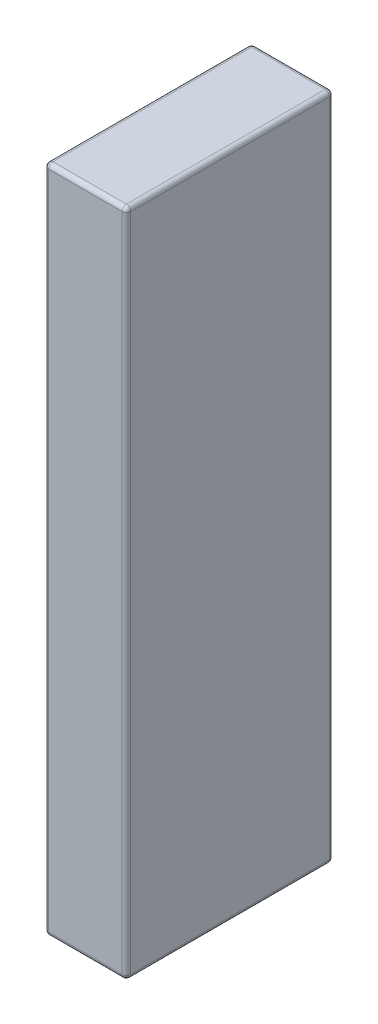
ISO-10303-21;
HEADER;
FILE_DESCRIPTION(('STEP AP214'),'2;1');
FILE_NAME('part.step','',(''),(''),'','','');
FILE_SCHEMA(('AUTOMOTIVE_DESIGN { 1 0 10303 214 1 1 1 1 }'));
ENDSEC;
DATA;
#1=APPLICATION_CONTEXT('core data for automotive mechanical design processes');
#2=APPLICATION_PROTOCOL_DEFINITION('international standard','automotive_design',2000,#1);
#3=PRODUCT_CONTEXT('',#1,'mechanical');
#4=PRODUCT('Part','Part','',(#3));
#5=PRODUCT_RELATED_PRODUCT_CATEGORY('part','',(#4));
#6=PRODUCT_DEFINITION_FORMATION('','',#4);
#7=PRODUCT_DEFINITION_CONTEXT('part definition',#1,'design');
#8=PRODUCT_DEFINITION('design','',#6,#7);
#9=PRODUCT_DEFINITION_SHAPE('','',#8);
#10=(LENGTH_UNIT() NAMED_UNIT(*) SI_UNIT(.MILLI.,.METRE.));
#11=(NAMED_UNIT(*) PLANE_ANGLE_UNIT() SI_UNIT($,.RADIAN.));
#12=(NAMED_UNIT(*) SI_UNIT($,.STERADIAN.) SOLID_ANGLE_UNIT());
#13=UNCERTAINTY_MEASURE_WITH_UNIT(LENGTH_MEASURE(1.E-05),#10,'distance_accuracy_value','');
#14=(GEOMETRIC_REPRESENTATION_CONTEXT(3) GLOBAL_UNCERTAINTY_ASSIGNED_CONTEXT((#13)) GLOBAL_UNIT_ASSIGNED_CONTEXT((#10,
#11,#12)) REPRESENTATION_CONTEXT('',''));
#15=CARTESIAN_POINT('',(0.,0.,0.));
#16=DIRECTION('',(0.,0.,1.));
#17=DIRECTION('',(1.,0.,0.));
#18=AXIS2_PLACEMENT_3D('',#15,#16,#17);
#19=CARTESIAN_POINT('',(-9.50000000000001,77.5,48.));
#20=DIRECTION('',(1.,0.,0.));
#21=DIRECTION('',(0.,1.,0.));
#22=AXIS2_PLACEMENT_3D('',#19,#20,#21);
#23=PLANE('',#22);
#24=DIRECTION('',(0.,0.,-1.));
#25=VECTOR('',#24,1.);
#26=CARTESIAN_POINT('',(-9.50000000000001,76.5,48.));
#27=LINE('',#26,#25);
#28=CARTESIAN_POINT('',(-9.50000000000001,76.5,47.));
#29=VERTEX_POINT('',#28);
#30=CARTESIAN_POINT('',(-9.50000000000001,76.5,1.));
#31=VERTEX_POINT('',#30);
#32=EDGE_CURVE('E139',#29,#31,#27,.T.);
#33=ORIENTED_EDGE('',*,*,#32,.T.);
#34=DIRECTION('',(0.,-1.,0.));
#35=VECTOR('',#34,1.);
#36=CARTESIAN_POINT('',(-9.49999999999999,-77.5,1.));
#37=LINE('',#36,#35);
#38=CARTESIAN_POINT('',(-9.49999999999999,-76.5,1.));
#39=VERTEX_POINT('',#38);
#40=EDGE_CURVE('E135',#31,#39,#37,.T.);
#41=ORIENTED_EDGE('',*,*,#40,.T.);
#42=DIRECTION('',(0.,0.,-1.));
#43=VECTOR('',#42,1.);
#44=CARTESIAN_POINT('',(-9.49999999999999,-76.5,48.));
#45=LINE('',#44,#43);
#46=CARTESIAN_POINT('',(-9.49999999999999,-76.5,47.));
#47=VERTEX_POINT('',#46);
#48=EDGE_CURVE('E128',#39,#47,#45,.F.);
#49=ORIENTED_EDGE('',*,*,#48,.T.);
#50=DIRECTION('',(0.,-1.,0.));
#51=VECTOR('',#50,1.);
#52=CARTESIAN_POINT('',(-9.50000000000001,77.5,47.));
#53=LINE('',#52,#51);
#54=EDGE_CURVE('E132',#47,#29,#53,.F.);
#55=ORIENTED_EDGE('',*,*,#54,.T.);
#56=EDGE_LOOP('',(#33,#41,#49,#55));
#57=FACE_BOUND('',#56,.T.);
#58=ADVANCED_FACE('F40',(#57),#23,.F.);
#59=CARTESIAN_POINT('',(9.50000000000001,-77.5,48.));
#60=DIRECTION('',(0.,1.,0.));
#61=DIRECTION('',(-1.,0.,0.));
#62=AXIS2_PLACEMENT_3D('',#59,#60,#61);
#63=PLANE('',#62);
#64=DIRECTION('',(0.,0.,-1.));
#65=VECTOR('',#64,1.);
#66=CARTESIAN_POINT('',(-8.49999999999999,-77.5,48.));
#67=LINE('',#66,#65);
#68=CARTESIAN_POINT('',(-8.49999999999999,-77.5,47.));
#69=VERTEX_POINT('',#68);
#70=CARTESIAN_POINT('',(-8.49999999999999,-77.5,1.));
#71=VERTEX_POINT('',#70);
#72=EDGE_CURVE('E147',#69,#71,#67,.T.);
#73=ORIENTED_EDGE('',*,*,#72,.T.);
#74=DIRECTION('',(1.,0.,0.));
#75=VECTOR('',#74,1.);
#76=CARTESIAN_POINT('',(9.50000000000001,-77.5,1.));
#77=LINE('',#76,#75);
#78=CARTESIAN_POINT('',(8.50000000000001,-77.5,1.));
#79=VERTEX_POINT('',#78);
#80=EDGE_CURVE('E185',#71,#79,#77,.T.);
#81=ORIENTED_EDGE('',*,*,#80,.T.);
#82=DIRECTION('',(0.,0.,-1.));
#83=VECTOR('',#82,1.);
#84=CARTESIAN_POINT('',(8.50000000000001,-77.5,48.));
#85=LINE('',#84,#83);
#86=CARTESIAN_POINT('',(8.50000000000001,-77.5,47.));
#87=VERTEX_POINT('',#86);
#88=EDGE_CURVE('E182',#79,#87,#85,.F.);
#89=ORIENTED_EDGE('',*,*,#88,.T.);
#90=DIRECTION('',(1.,0.,0.));
#91=VECTOR('',#90,1.);
#92=CARTESIAN_POINT('',(9.50000000000001,-77.5,47.));
#93=LINE('',#92,#91);
#94=EDGE_CURVE('E180',#87,#69,#93,.F.);
#95=ORIENTED_EDGE('',*,*,#94,.T.);
#96=EDGE_LOOP('',(#73,#81,#89,#95));
#97=FACE_BOUND('',#96,.T.);
#98=ADVANCED_FACE('F302',(#97),#63,.F.);
#99=CARTESIAN_POINT('',(9.49999999999999,77.5,48.));
#100=DIRECTION('',(-1.,0.,0.));
#101=DIRECTION('',(0.,-1.,0.));
#102=AXIS2_PLACEMENT_3D('',#99,#100,#101);
#103=PLANE('',#102);
#104=DIRECTION('',(0.,0.,-1.));
#105=VECTOR('',#104,1.);
#106=CARTESIAN_POINT('',(9.50000000000001,-76.5,48.));
#107=LINE('',#106,#105);
#108=CARTESIAN_POINT('',(9.50000000000001,-76.5,47.));
#109=VERTEX_POINT('',#108);
#110=CARTESIAN_POINT('',(9.50000000000001,-76.5,1.));
#111=VERTEX_POINT('',#110);
#112=EDGE_CURVE('E191',#109,#111,#107,.T.);
#113=ORIENTED_EDGE('',*,*,#112,.T.);
#114=DIRECTION('',(0.,1.,0.));
#115=VECTOR('',#114,1.);
#116=CARTESIAN_POINT('',(9.49999999999999,77.5,1.));
#117=LINE('',#116,#115);
#118=CARTESIAN_POINT('',(9.49999999999999,76.5,1.));
#119=VERTEX_POINT('',#118);
#120=EDGE_CURVE('E194',#111,#119,#117,.T.);
#121=ORIENTED_EDGE('',*,*,#120,.T.);
#122=DIRECTION('',(0.,0.,-1.));
#123=VECTOR('',#122,1.);
#124=CARTESIAN_POINT('',(9.49999999999999,76.5,48.));
#125=LINE('',#124,#123);
#126=CARTESIAN_POINT('',(9.49999999999999,76.5,47.));
#127=VERTEX_POINT('',#126);
#128=EDGE_CURVE('E189',#119,#127,#125,.F.);
#129=ORIENTED_EDGE('',*,*,#128,.T.);
#130=DIRECTION('',(0.,1.,0.));
#131=VECTOR('',#130,1.);
#132=CARTESIAN_POINT('',(9.49999999999999,77.5,47.));
#133=LINE('',#132,#131);
#134=EDGE_CURVE('E187',#127,#109,#133,.F.);
#135=ORIENTED_EDGE('',*,*,#134,.T.);
#136=EDGE_LOOP('',(#113,#121,#129,#135));
#137=FACE_BOUND('',#136,.T.);
#138=ADVANCED_FACE('F279',(#137),#103,.F.);
#139=CARTESIAN_POINT('',(9.49999999999999,77.5,48.));
#140=DIRECTION('',(0.,-1.,0.));
#141=DIRECTION('',(0.,0.,-1.));
#142=AXIS2_PLACEMENT_3D('',#139,#140,#141);
#143=PLANE('',#142);
#144=DIRECTION('',(0.,0.,-1.));
#145=VECTOR('',#144,1.);
#146=CARTESIAN_POINT('',(8.49999999999999,77.5,48.));
#147=LINE('',#146,#145);
#148=CARTESIAN_POINT('',(8.49999999999999,77.5,47.));
#149=VERTEX_POINT('',#148);
#150=CARTESIAN_POINT('',(8.49999999999999,77.5,1.));
#151=VERTEX_POINT('',#150);
#152=EDGE_CURVE('E173',#149,#151,#147,.T.);
#153=ORIENTED_EDGE('',*,*,#152,.T.);
#154=DIRECTION('',(-1.,0.,0.));
#155=VECTOR('',#154,1.);
#156=CARTESIAN_POINT('',(-9.50000000000001,77.5,1.));
#157=LINE('',#156,#155);
#158=CARTESIAN_POINT('',(-8.50000000000001,77.5,1.));
#159=VERTEX_POINT('',#158);
#160=EDGE_CURVE('E178',#151,#159,#157,.T.);
#161=ORIENTED_EDGE('',*,*,#160,.T.);
#162=DIRECTION('',(0.,0.,-1.));
#163=VECTOR('',#162,1.);
#164=CARTESIAN_POINT('',(-8.50000000000001,77.5,48.));
#165=LINE('',#164,#163);
#166=CARTESIAN_POINT('',(-8.50000000000001,77.5,47.));
#167=VERTEX_POINT('',#166);
#168=EDGE_CURVE('E175',#159,#167,#165,.F.);
#169=ORIENTED_EDGE('',*,*,#168,.T.);
#170=DIRECTION('',(-1.,0.,0.));
#171=VECTOR('',#170,1.);
#172=CARTESIAN_POINT('',(9.49999999999999,77.5,47.));
#173=LINE('',#172,#171);
#174=EDGE_CURVE('E171',#167,#149,#173,.F.);
#175=ORIENTED_EDGE('',*,*,#174,.T.);
#176=EDGE_LOOP('',(#153,#161,#169,#175));
#177=FACE_BOUND('',#176,.T.);
#178=ADVANCED_FACE('F309',(#177),#143,.F.);
#179=CARTESIAN_POINT('',(0.,0.,48.));
#180=DIRECTION('',(0.,0.,-1.));
#181=DIRECTION('',(-1.,0.,0.));
#182=AXIS2_PLACEMENT_3D('',#179,#180,#181);
#183=PLANE('',#182);
#184=DIRECTION('',(0.,1.,0.));
#185=VECTOR('',#184,1.);
#186=CARTESIAN_POINT('',(8.5,0.,48.));
#187=LINE('',#186,#185);
#188=CARTESIAN_POINT('',(8.50000000000001,-76.5,48.));
#189=VERTEX_POINT('',#188);
#190=CARTESIAN_POINT('',(8.49999999999999,76.5,48.));
#191=VERTEX_POINT('',#190);
#192=EDGE_CURVE('E49',#189,#191,#187,.T.);
#193=ORIENTED_EDGE('',*,*,#192,.T.);
#194=DIRECTION('',(-1.,0.,0.));
#195=VECTOR('',#194,1.);
#196=CARTESIAN_POINT('',(0.,76.5,48.));
#197=LINE('',#196,#195);
#198=CARTESIAN_POINT('',(-8.50000000000001,76.5,48.));
#199=VERTEX_POINT('',#198);
#200=EDGE_CURVE('E11',#191,#199,#197,.T.);
#201=ORIENTED_EDGE('',*,*,#200,.T.);
#202=DIRECTION('',(0.,-1.,0.));
#203=VECTOR('',#202,1.);
#204=CARTESIAN_POINT('',(-8.5,0.,48.));
#205=LINE('',#204,#203);
#206=CARTESIAN_POINT('',(-8.49999999999999,-76.5,48.));
#207=VERTEX_POINT('',#206);
#208=EDGE_CURVE('E205',#199,#207,#205,.T.);
#209=ORIENTED_EDGE('',*,*,#208,.T.);
#210=DIRECTION('',(1.,0.,0.));
#211=VECTOR('',#210,1.);
#212=CARTESIAN_POINT('',(0.,-76.5,48.));
#213=LINE('',#212,#211);
#214=EDGE_CURVE('E60',#207,#189,#213,.T.);
#215=ORIENTED_EDGE('',*,*,#214,.T.);
#216=EDGE_LOOP('',(#193,#201,#209,#215));
#217=FACE_BOUND('',#216,.T.);
#218=ADVANCED_FACE('F372',(#217),#183,.F.);
#219=CARTESIAN_POINT('',(0.,0.,0.));
#220=DIRECTION('',(0.,0.,-1.));
#221=DIRECTION('',(-1.,0.,0.));
#222=AXIS2_PLACEMENT_3D('',#219,#220,#221);
#223=PLANE('',#222);
#224=DIRECTION('',(0.,1.,0.));
#225=VECTOR('',#224,1.);
#226=CARTESIAN_POINT('',(8.50000000000001,-77.5,0.));
#227=LINE('',#226,#225);
#228=CARTESIAN_POINT('',(8.49999999999999,76.5,0.));
#229=VERTEX_POINT('',#228);
#230=CARTESIAN_POINT('',(8.50000000000001,-76.5,0.));
#231=VERTEX_POINT('',#230);
#232=EDGE_CURVE('E200',#229,#231,#227,.F.);
#233=ORIENTED_EDGE('',*,*,#232,.T.);
#234=DIRECTION('',(1.,0.,0.));
#235=VECTOR('',#234,1.);
#236=CARTESIAN_POINT('',(-9.49999999999999,-76.5,0.));
#237=LINE('',#236,#235);
#238=CARTESIAN_POINT('',(-8.49999999999999,-76.5,0.));
#239=VERTEX_POINT('',#238);
#240=EDGE_CURVE('E202',#231,#239,#237,.F.);
#241=ORIENTED_EDGE('',*,*,#240,.T.);
#242=DIRECTION('',(0.,-1.,0.));
#243=VECTOR('',#242,1.);
#244=CARTESIAN_POINT('',(-8.50000000000001,77.5,0.));
#245=LINE('',#244,#243);
#246=CARTESIAN_POINT('',(-8.50000000000001,76.5,0.));
#247=VERTEX_POINT('',#246);
#248=EDGE_CURVE('E196',#239,#247,#245,.F.);
#249=ORIENTED_EDGE('',*,*,#248,.T.);
#250=DIRECTION('',(-1.,0.,0.));
#251=VECTOR('',#250,1.);
#252=CARTESIAN_POINT('',(9.49999999999999,76.5,0.));
#253=LINE('',#252,#251);
#254=EDGE_CURVE('E198',#247,#229,#253,.F.);
#255=ORIENTED_EDGE('',*,*,#254,.T.);
#256=EDGE_LOOP('',(#233,#241,#249,#255));
#257=FACE_BOUND('',#256,.T.);
#258=ADVANCED_FACE('F271',(#257),#223,.T.);
#259=CARTESIAN_POINT('',(8.50000000000001,-76.5,48.));
#260=DIRECTION('',(0.,0.,-1.));
#261=DIRECTION('',(-1.,0.,0.));
#262=AXIS2_PLACEMENT_3D('',#259,#260,#261);
#263=CYLINDRICAL_SURFACE('',#262,1.);
#264=CARTESIAN_POINT('',(8.50000000000001,-76.5,47.));
#265=DIRECTION('',(0.,0.,1.));
#266=DIRECTION('',(1.,0.,0.));
#267=AXIS2_PLACEMENT_3D('',#264,#265,#266);
#268=CIRCLE('',#267,1.);
#269=EDGE_CURVE('E44',#87,#109,#268,.T.);
#270=ORIENTED_EDGE('',*,*,#269,.F.);
#271=ORIENTED_EDGE('',*,*,#88,.F.);
#272=CARTESIAN_POINT('',(8.50000000000001,-76.5,1.));
#273=DIRECTION('',(0.,0.,-1.));
#274=DIRECTION('',(-1.,0.,0.));
#275=AXIS2_PLACEMENT_3D('',#272,#273,#274);
#276=CIRCLE('',#275,1.);
#277=EDGE_CURVE('E167',#111,#79,#276,.T.);
#278=ORIENTED_EDGE('',*,*,#277,.F.);
#279=ORIENTED_EDGE('',*,*,#112,.F.);
#280=EDGE_LOOP('',(#270,#271,#278,#279));
#281=FACE_BOUND('',#280,.T.);
#282=ADVANCED_FACE('F42',(#281),#263,.T.);
#283=CARTESIAN_POINT('',(8.50000000000001,-76.5,47.));
#284=DIRECTION('',(1.,0.,0.));
#285=DIRECTION('',(0.,1.,0.));
#286=AXIS2_PLACEMENT_3D('',#283,#284,#285);
#287=SPHERICAL_SURFACE('',#286,1.);
#288=CARTESIAN_POINT('',(8.50000000000001,-76.5,47.));
#289=DIRECTION('',(1.,0.,0.));
#290=DIRECTION('',(0.,0.,-1.));
#291=AXIS2_PLACEMENT_3D('',#288,#289,#290);
#292=CIRCLE('',#291,1.);
#293=EDGE_CURVE('E252',#87,#189,#292,.F.);
#294=ORIENTED_EDGE('',*,*,#293,.F.);
#295=ORIENTED_EDGE('',*,*,#269,.T.);
#296=CARTESIAN_POINT('',(8.50000000000001,-76.5,47.));
#297=DIRECTION('',(0.,-1.,0.));
#298=DIRECTION('',(0.,0.,-1.));
#299=AXIS2_PLACEMENT_3D('',#296,#297,#298);
#300=CIRCLE('',#299,1.);
#301=EDGE_CURVE('E254',#189,#109,#300,.F.);
#302=ORIENTED_EDGE('',*,*,#301,.F.);
#303=EDGE_LOOP('',(#294,#295,#302));
#304=FACE_BOUND('',#303,.T.);
#305=ADVANCED_FACE('F297',(#304),#287,.T.);
#306=CARTESIAN_POINT('',(8.50000000000001,-76.5,1.));
#307=DIRECTION('',(0.,-1.,0.));
#308=DIRECTION('',(0.,0.,-1.));
#309=AXIS2_PLACEMENT_3D('',#306,#307,#308);
#310=SPHERICAL_SURFACE('',#309,1.);
#311=CARTESIAN_POINT('',(8.50000000000001,-76.5,1.));
#312=DIRECTION('',(0.,-1.,0.));
#313=DIRECTION('',(1.,0.,0.));
#314=AXIS2_PLACEMENT_3D('',#311,#312,#313);
#315=CIRCLE('',#314,1.);
#316=EDGE_CURVE('E246',#111,#231,#315,.F.);
#317=ORIENTED_EDGE('',*,*,#316,.F.);
#318=ORIENTED_EDGE('',*,*,#277,.T.);
#319=CARTESIAN_POINT('',(8.50000000000001,-76.5,1.));
#320=DIRECTION('',(1.,0.,0.));
#321=DIRECTION('',(0.,0.,-1.));
#322=AXIS2_PLACEMENT_3D('',#319,#320,#321);
#323=CIRCLE('',#322,1.);
#324=EDGE_CURVE('E249',#231,#79,#323,.F.);
#325=ORIENTED_EDGE('',*,*,#324,.F.);
#326=EDGE_LOOP('',(#317,#318,#325));
#327=FACE_BOUND('',#326,.T.);
#328=ADVANCED_FACE('F261',(#327),#310,.T.);
#329=CARTESIAN_POINT('',(8.5,0.,47.));
#330=DIRECTION('',(0.,1.,0.));
#331=DIRECTION('',(-1.,0.,0.));
#332=AXIS2_PLACEMENT_3D('',#329,#330,#331);
#333=CYLINDRICAL_SURFACE('',#332,1.);
#334=ORIENTED_EDGE('',*,*,#301,.T.);
#335=ORIENTED_EDGE('',*,*,#134,.F.);
#336=CARTESIAN_POINT('',(8.49999999999999,76.5,47.));
#337=DIRECTION('',(0.,1.,0.));
#338=DIRECTION('',(0.,0.,1.));
#339=AXIS2_PLACEMENT_3D('',#336,#337,#338);
#340=CIRCLE('',#339,1.);
#341=EDGE_CURVE('E240',#191,#127,#340,.T.);
#342=ORIENTED_EDGE('',*,*,#341,.F.);
#343=ORIENTED_EDGE('',*,*,#192,.F.);
#344=EDGE_LOOP('',(#334,#335,#342,#343));
#345=FACE_BOUND('',#344,.T.);
#346=ADVANCED_FACE('F292',(#345),#333,.T.);
#347=CARTESIAN_POINT('',(0.,-76.5,47.));
#348=DIRECTION('',(1.,0.,0.));
#349=DIRECTION('',(0.,1.,0.));
#350=AXIS2_PLACEMENT_3D('',#347,#348,#349);
#351=CYLINDRICAL_SURFACE('',#350,1.);
#352=ORIENTED_EDGE('',*,*,#293,.T.);
#353=ORIENTED_EDGE('',*,*,#214,.F.);
#354=CARTESIAN_POINT('',(-8.49999999999999,-76.5,47.));
#355=DIRECTION('',(-1.,0.,0.));
#356=DIRECTION('',(0.,0.,1.));
#357=AXIS2_PLACEMENT_3D('',#354,#355,#356);
#358=CIRCLE('',#357,1.);
#359=EDGE_CURVE('E151',#69,#207,#358,.T.);
#360=ORIENTED_EDGE('',*,*,#359,.F.);
#361=ORIENTED_EDGE('',*,*,#94,.F.);
#362=EDGE_LOOP('',(#352,#353,#360,#361));
#363=FACE_BOUND('',#362,.T.);
#364=ADVANCED_FACE('F300',(#363),#351,.T.);
#365=CARTESIAN_POINT('',(-8.49999999999999,-76.5,48.));
#366=DIRECTION('',(0.,0.,-1.));
#367=DIRECTION('',(-1.,0.,0.));
#368=AXIS2_PLACEMENT_3D('',#365,#366,#367);
#369=CYLINDRICAL_SURFACE('',#368,1.);
#370=CARTESIAN_POINT('',(-8.49999999999999,-76.5,1.));
#371=DIRECTION('',(0.,0.,-1.));
#372=DIRECTION('',(-1.,0.,0.));
#373=AXIS2_PLACEMENT_3D('',#370,#371,#372);
#374=CIRCLE('',#373,1.);
#375=EDGE_CURVE('E152',#71,#39,#374,.T.);
#376=ORIENTED_EDGE('',*,*,#375,.F.);
#377=ORIENTED_EDGE('',*,*,#72,.F.);
#378=CARTESIAN_POINT('',(-8.49999999999999,-76.5,47.));
#379=DIRECTION('',(0.,0.,1.));
#380=DIRECTION('',(1.,0.,0.));
#381=AXIS2_PLACEMENT_3D('',#378,#379,#380);
#382=CIRCLE('',#381,1.);
#383=EDGE_CURVE('E143',#47,#69,#382,.T.);
#384=ORIENTED_EDGE('',*,*,#383,.F.);
#385=ORIENTED_EDGE('',*,*,#48,.F.);
#386=EDGE_LOOP('',(#376,#377,#384,#385));
#387=FACE_BOUND('',#386,.T.);
#388=ADVANCED_FACE('F145',(#387),#369,.T.);
#389=CARTESIAN_POINT('',(9.50000000000001,-76.5,1.));
#390=DIRECTION('',(-1.,0.,0.));
#391=DIRECTION('',(0.,-1.,0.));
#392=AXIS2_PLACEMENT_3D('',#389,#390,#391);
#393=CYLINDRICAL_SURFACE('',#392,1.);
#394=ORIENTED_EDGE('',*,*,#324,.T.);
#395=ORIENTED_EDGE('',*,*,#80,.F.);
#396=CARTESIAN_POINT('',(-8.49999999999999,-76.5,1.));
#397=DIRECTION('',(-1.,0.,0.));
#398=DIRECTION('',(0.,-1.,0.));
#399=AXIS2_PLACEMENT_3D('',#396,#397,#398);
#400=CIRCLE('',#399,1.);
#401=EDGE_CURVE('E236',#239,#71,#400,.T.);
#402=ORIENTED_EDGE('',*,*,#401,.F.);
#403=ORIENTED_EDGE('',*,*,#240,.F.);
#404=EDGE_LOOP('',(#394,#395,#402,#403));
#405=FACE_BOUND('',#404,.T.);
#406=ADVANCED_FACE('F268',(#405),#393,.T.);
#407=CARTESIAN_POINT('',(8.49999999999999,77.5,1.));
#408=DIRECTION('',(0.,-1.,0.));
#409=DIRECTION('',(1.,0.,0.));
#410=AXIS2_PLACEMENT_3D('',#407,#408,#409);
#411=CYLINDRICAL_SURFACE('',#410,1.);
#412=ORIENTED_EDGE('',*,*,#316,.T.);
#413=ORIENTED_EDGE('',*,*,#232,.F.);
#414=CARTESIAN_POINT('',(8.49999999999999,76.5,1.));
#415=DIRECTION('',(0.,1.,0.));
#416=DIRECTION('',(0.,0.,1.));
#417=AXIS2_PLACEMENT_3D('',#414,#415,#416);
#418=CIRCLE('',#417,1.);
#419=EDGE_CURVE('E233',#119,#229,#418,.T.);
#420=ORIENTED_EDGE('',*,*,#419,.F.);
#421=ORIENTED_EDGE('',*,*,#120,.F.);
#422=EDGE_LOOP('',(#412,#413,#420,#421));
#423=FACE_BOUND('',#422,.T.);
#424=ADVANCED_FACE('F276',(#423),#411,.T.);
#425=CARTESIAN_POINT('',(8.49999999999999,76.5,48.));
#426=DIRECTION('',(0.,0.,-1.));
#427=DIRECTION('',(-1.,0.,0.));
#428=AXIS2_PLACEMENT_3D('',#425,#426,#427);
#429=CYLINDRICAL_SURFACE('',#428,1.);
#430=CARTESIAN_POINT('',(8.49999999999999,76.5,47.));
#431=DIRECTION('',(0.,0.,1.));
#432=DIRECTION('',(1.,0.,0.));
#433=AXIS2_PLACEMENT_3D('',#430,#431,#432);
#434=CIRCLE('',#433,1.);
#435=EDGE_CURVE('E243',#127,#149,#434,.T.);
#436=ORIENTED_EDGE('',*,*,#435,.F.);
#437=ORIENTED_EDGE('',*,*,#128,.F.);
#438=CARTESIAN_POINT('',(8.49999999999999,76.5,1.));
#439=DIRECTION('',(0.,0.,-1.));
#440=DIRECTION('',(-1.,0.,0.));
#441=AXIS2_PLACEMENT_3D('',#438,#439,#440);
#442=CIRCLE('',#441,1.);
#443=EDGE_CURVE('E230',#151,#119,#442,.T.);
#444=ORIENTED_EDGE('',*,*,#443,.F.);
#445=ORIENTED_EDGE('',*,*,#152,.F.);
#446=EDGE_LOOP('',(#436,#437,#444,#445));
#447=FACE_BOUND('',#446,.T.);
#448=ADVANCED_FACE('F284',(#447),#429,.T.);
#449=CARTESIAN_POINT('',(8.49999999999999,76.5,47.));
#450=DIRECTION('',(1.,0.,0.));
#451=DIRECTION('',(0.,0.,-1.));
#452=AXIS2_PLACEMENT_3D('',#449,#450,#451);
#453=SPHERICAL_SURFACE('',#452,1.);
#454=ORIENTED_EDGE('',*,*,#341,.T.);
#455=ORIENTED_EDGE('',*,*,#435,.T.);
#456=CARTESIAN_POINT('',(8.49999999999999,76.5,47.));
#457=DIRECTION('',(1.,0.,0.));
#458=DIRECTION('',(0.,0.,-1.));
#459=AXIS2_PLACEMENT_3D('',#456,#457,#458);
#460=CIRCLE('',#459,1.);
#461=EDGE_CURVE('E159',#191,#149,#460,.F.);
#462=ORIENTED_EDGE('',*,*,#461,.F.);
#463=EDGE_LOOP('',(#454,#455,#462));
#464=FACE_BOUND('',#463,.T.);
#465=ADVANCED_FACE('F289',(#464),#453,.T.);
#466=CARTESIAN_POINT('',(-8.49999999999999,-76.5,47.));
#467=DIRECTION('',(0.,-1.,0.));
#468=DIRECTION('',(1.,0.,0.));
#469=AXIS2_PLACEMENT_3D('',#466,#467,#468);
#470=SPHERICAL_SURFACE('',#469,1.);
#471=ORIENTED_EDGE('',*,*,#383,.T.);
#472=ORIENTED_EDGE('',*,*,#359,.T.);
#473=CARTESIAN_POINT('',(-8.49999999999999,-76.5,47.));
#474=DIRECTION('',(0.,-1.,0.));
#475=DIRECTION('',(1.,0.,0.));
#476=AXIS2_PLACEMENT_3D('',#473,#474,#475);
#477=CIRCLE('',#476,1.);
#478=EDGE_CURVE('E155',#47,#207,#477,.F.);
#479=ORIENTED_EDGE('',*,*,#478,.F.);
#480=EDGE_LOOP('',(#471,#472,#479));
#481=FACE_BOUND('',#480,.T.);
#482=ADVANCED_FACE('F156',(#481),#470,.T.);
#483=CARTESIAN_POINT('',(-8.49999999999999,-76.5,1.));
#484=DIRECTION('',(0.,-1.,0.));
#485=DIRECTION('',(1.,0.,0.));
#486=AXIS2_PLACEMENT_3D('',#483,#484,#485);
#487=SPHERICAL_SURFACE('',#486,1.);
#488=ORIENTED_EDGE('',*,*,#401,.T.);
#489=ORIENTED_EDGE('',*,*,#375,.T.);
#490=CARTESIAN_POINT('',(-8.49999999999999,-76.5,1.));
#491=DIRECTION('',(0.,-1.,0.));
#492=DIRECTION('',(0.,0.,-1.));
#493=AXIS2_PLACEMENT_3D('',#490,#491,#492);
#494=CIRCLE('',#493,1.);
#495=EDGE_CURVE('E160',#239,#39,#494,.F.);
#496=ORIENTED_EDGE('',*,*,#495,.F.);
#497=EDGE_LOOP('',(#488,#489,#496));
#498=FACE_BOUND('',#497,.T.);
#499=ADVANCED_FACE('F343',(#498),#487,.T.);
#500=CARTESIAN_POINT('',(8.49999999999999,76.5,1.));
#501=DIRECTION('',(1.,0.,0.));
#502=DIRECTION('',(0.,0.,-1.));
#503=AXIS2_PLACEMENT_3D('',#500,#501,#502);
#504=SPHERICAL_SURFACE('',#503,1.);
#505=ORIENTED_EDGE('',*,*,#443,.T.);
#506=ORIENTED_EDGE('',*,*,#419,.T.);
#507=CARTESIAN_POINT('',(8.49999999999999,76.5,1.));
#508=DIRECTION('',(1.,0.,0.));
#509=DIRECTION('',(0.,0.,-1.));
#510=AXIS2_PLACEMENT_3D('',#507,#508,#509);
#511=CIRCLE('',#510,1.);
#512=EDGE_CURVE('E223',#151,#229,#511,.F.);
#513=ORIENTED_EDGE('',*,*,#512,.F.);
#514=EDGE_LOOP('',(#505,#506,#513));
#515=FACE_BOUND('',#514,.T.);
#516=ADVANCED_FACE('F339',(#515),#504,.T.);
#517=CARTESIAN_POINT('',(0.,76.5,47.));
#518=DIRECTION('',(-1.,0.,0.));
#519=DIRECTION('',(0.,0.,1.));
#520=AXIS2_PLACEMENT_3D('',#517,#518,#519);
#521=CYLINDRICAL_SURFACE('',#520,1.);
#522=ORIENTED_EDGE('',*,*,#461,.T.);
#523=ORIENTED_EDGE('',*,*,#174,.F.);
#524=CARTESIAN_POINT('',(-8.50000000000001,76.5,47.));
#525=DIRECTION('',(-1.,0.,0.));
#526=DIRECTION('',(0.,-1.,0.));
#527=AXIS2_PLACEMENT_3D('',#524,#525,#526);
#528=CIRCLE('',#527,1.);
#529=EDGE_CURVE('E220',#199,#167,#528,.T.);
#530=ORIENTED_EDGE('',*,*,#529,.F.);
#531=ORIENTED_EDGE('',*,*,#200,.F.);
#532=EDGE_LOOP('',(#522,#523,#530,#531));
#533=FACE_BOUND('',#532,.T.);
#534=ADVANCED_FACE('F336',(#533),#521,.T.);
#535=CARTESIAN_POINT('',(-8.5,0.,47.));
#536=DIRECTION('',(0.,-1.,0.));
#537=DIRECTION('',(1.,0.,0.));
#538=AXIS2_PLACEMENT_3D('',#535,#536,#537);
#539=CYLINDRICAL_SURFACE('',#538,1.);
#540=ORIENTED_EDGE('',*,*,#478,.T.);
#541=ORIENTED_EDGE('',*,*,#208,.F.);
#542=CARTESIAN_POINT('',(-8.50000000000001,76.5,47.));
#543=DIRECTION('',(0.,1.,0.));
#544=DIRECTION('',(0.,0.,1.));
#545=AXIS2_PLACEMENT_3D('',#542,#543,#544);
#546=CIRCLE('',#545,1.);
#547=EDGE_CURVE('E163',#29,#199,#546,.T.);
#548=ORIENTED_EDGE('',*,*,#547,.F.);
#549=ORIENTED_EDGE('',*,*,#54,.F.);
#550=EDGE_LOOP('',(#540,#541,#548,#549));
#551=FACE_BOUND('',#550,.T.);
#552=ADVANCED_FACE('F162',(#551),#539,.T.);
#553=CARTESIAN_POINT('',(-8.50000000000001,77.5,1.));
#554=DIRECTION('',(0.,1.,0.));
#555=DIRECTION('',(-1.,0.,0.));
#556=AXIS2_PLACEMENT_3D('',#553,#554,#555);
#557=CYLINDRICAL_SURFACE('',#556,1.);
#558=ORIENTED_EDGE('',*,*,#495,.T.);
#559=ORIENTED_EDGE('',*,*,#40,.F.);
#560=CARTESIAN_POINT('',(-8.50000000000001,76.5,1.));
#561=DIRECTION('',(0.,1.,0.));
#562=DIRECTION('',(0.,0.,1.));
#563=AXIS2_PLACEMENT_3D('',#560,#561,#562);
#564=CIRCLE('',#563,1.);
#565=EDGE_CURVE('E216',#247,#31,#564,.T.);
#566=ORIENTED_EDGE('',*,*,#565,.F.);
#567=ORIENTED_EDGE('',*,*,#248,.F.);
#568=EDGE_LOOP('',(#558,#559,#566,#567));
#569=FACE_BOUND('',#568,.T.);
#570=ADVANCED_FACE('F329',(#569),#557,.T.);
#571=CARTESIAN_POINT('',(9.49999999999999,76.5,1.));
#572=DIRECTION('',(1.,0.,0.));
#573=DIRECTION('',(0.,0.,-1.));
#574=AXIS2_PLACEMENT_3D('',#571,#572,#573);
#575=CYLINDRICAL_SURFACE('',#574,1.);
#576=ORIENTED_EDGE('',*,*,#512,.T.);
#577=ORIENTED_EDGE('',*,*,#254,.F.);
#578=CARTESIAN_POINT('',(-8.50000000000001,76.5,1.));
#579=DIRECTION('',(-1.,0.,0.));
#580=DIRECTION('',(0.,0.,1.));
#581=AXIS2_PLACEMENT_3D('',#578,#579,#580);
#582=CIRCLE('',#581,1.);
#583=EDGE_CURVE('E213',#159,#247,#582,.T.);
#584=ORIENTED_EDGE('',*,*,#583,.F.);
#585=ORIENTED_EDGE('',*,*,#160,.F.);
#586=EDGE_LOOP('',(#576,#577,#584,#585));
#587=FACE_BOUND('',#586,.T.);
#588=ADVANCED_FACE('F325',(#587),#575,.T.);
#589=CARTESIAN_POINT('',(-8.50000000000001,76.5,47.));
#590=DIRECTION('',(0.,0.,1.));
#591=DIRECTION('',(1.,0.,0.));
#592=AXIS2_PLACEMENT_3D('',#589,#590,#591);
#593=SPHERICAL_SURFACE('',#592,1.);
#594=ORIENTED_EDGE('',*,*,#547,.T.);
#595=ORIENTED_EDGE('',*,*,#529,.T.);
#596=CARTESIAN_POINT('',(-8.50000000000001,76.5,47.));
#597=DIRECTION('',(0.,0.,1.));
#598=DIRECTION('',(1.,0.,0.));
#599=AXIS2_PLACEMENT_3D('',#596,#597,#598);
#600=CIRCLE('',#599,1.);
#601=EDGE_CURVE('E211',#29,#167,#600,.F.);
#602=ORIENTED_EDGE('',*,*,#601,.F.);
#603=EDGE_LOOP('',(#594,#595,#602));
#604=FACE_BOUND('',#603,.T.);
#605=ADVANCED_FACE('F321',(#604),#593,.T.);
#606=CARTESIAN_POINT('',(-8.50000000000001,76.5,1.));
#607=DIRECTION('',(0.,0.,-1.));
#608=DIRECTION('',(-1.,0.,0.));
#609=AXIS2_PLACEMENT_3D('',#606,#607,#608);
#610=SPHERICAL_SURFACE('',#609,1.);
#611=ORIENTED_EDGE('',*,*,#583,.T.);
#612=ORIENTED_EDGE('',*,*,#565,.T.);
#613=CARTESIAN_POINT('',(-8.50000000000001,76.5,1.));
#614=DIRECTION('',(0.,0.,-1.));
#615=DIRECTION('',(-1.,0.,0.));
#616=AXIS2_PLACEMENT_3D('',#613,#614,#615);
#617=CIRCLE('',#616,1.);
#618=EDGE_CURVE('E209',#159,#31,#617,.F.);
#619=ORIENTED_EDGE('',*,*,#618,.F.);
#620=EDGE_LOOP('',(#611,#612,#619));
#621=FACE_BOUND('',#620,.T.);
#622=ADVANCED_FACE('F317',(#621),#610,.T.);
#623=CARTESIAN_POINT('',(-8.50000000000001,76.5,48.));
#624=DIRECTION('',(0.,0.,-1.));
#625=DIRECTION('',(-1.,0.,0.));
#626=AXIS2_PLACEMENT_3D('',#623,#624,#625);
#627=CYLINDRICAL_SURFACE('',#626,1.);
#628=ORIENTED_EDGE('',*,*,#601,.T.);
#629=ORIENTED_EDGE('',*,*,#168,.F.);
#630=ORIENTED_EDGE('',*,*,#618,.T.);
#631=ORIENTED_EDGE('',*,*,#32,.F.);
#632=EDGE_LOOP('',(#628,#629,#630,#631));
#633=FACE_BOUND('',#632,.T.);
#634=ADVANCED_FACE('F314',(#633),#627,.T.);
#635=CLOSED_SHELL('',(#58,#98,#138,#178,#218,#258,#282,#305,#328,#346,#364,#388,#406,#424,#448,
#465,#482,#499,#516,#534,#552,#570,#588,#605,#622,#634));
#636=MANIFOLD_SOLID_BREP('B2',#635);
#637=ADVANCED_BREP_SHAPE_REPRESENTATION('',(#18,#636),#14);
#638=SHAPE_DEFINITION_REPRESENTATION(#9,#637);
ENDSEC;
END-ISO-10303-21;
